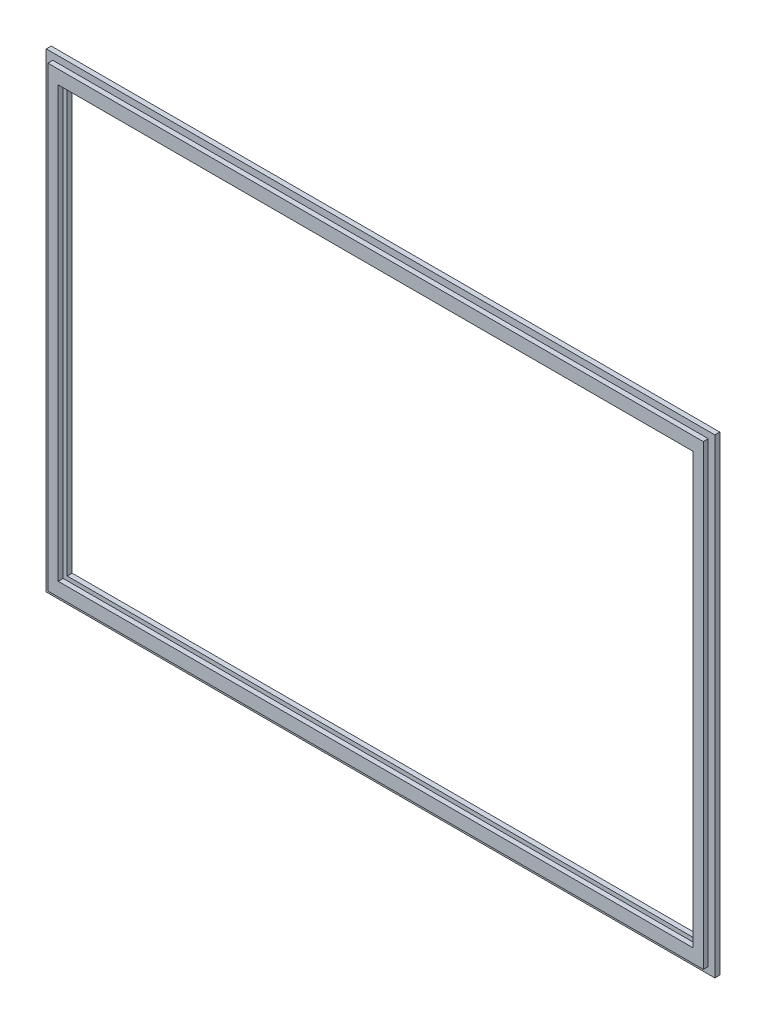
ISO-10303-21;
HEADER;
FILE_DESCRIPTION(('STEP AP214'),'2;1');
FILE_NAME('part.step','',(''),(''),'','','');
FILE_SCHEMA(('AUTOMOTIVE_DESIGN { 1 0 10303 214 1 1 1 1 }'));
ENDSEC;
DATA;
#1=APPLICATION_CONTEXT('core data for automotive mechanical design processes');
#2=APPLICATION_PROTOCOL_DEFINITION('international standard','automotive_design',2000,#1);
#3=PRODUCT_CONTEXT('',#1,'mechanical');
#4=PRODUCT('Part','Part','',(#3));
#5=PRODUCT_RELATED_PRODUCT_CATEGORY('part','',(#4));
#6=PRODUCT_DEFINITION_FORMATION('','',#4);
#7=PRODUCT_DEFINITION_CONTEXT('part definition',#1,'design');
#8=PRODUCT_DEFINITION('design','',#6,#7);
#9=PRODUCT_DEFINITION_SHAPE('','',#8);
#10=(LENGTH_UNIT() NAMED_UNIT(*) SI_UNIT(.MILLI.,.METRE.));
#11=(NAMED_UNIT(*) PLANE_ANGLE_UNIT() SI_UNIT($,.RADIAN.));
#12=(NAMED_UNIT(*) SI_UNIT($,.STERADIAN.) SOLID_ANGLE_UNIT());
#13=UNCERTAINTY_MEASURE_WITH_UNIT(LENGTH_MEASURE(1.E-05),#10,'distance_accuracy_value','');
#14=(GEOMETRIC_REPRESENTATION_CONTEXT(3) GLOBAL_UNCERTAINTY_ASSIGNED_CONTEXT((#13)) GLOBAL_UNIT_ASSIGNED_CONTEXT((#10,
#11,#12)) REPRESENTATION_CONTEXT('',''));
#15=CARTESIAN_POINT('',(0.,0.,0.));
#16=DIRECTION('',(0.,0.,1.));
#17=DIRECTION('',(1.,0.,0.));
#18=AXIS2_PLACEMENT_3D('',#15,#16,#17);
#19=CARTESIAN_POINT('',(0.,0.,0.6));
#20=DIRECTION('',(0.,0.,1.));
#21=DIRECTION('',(1.,0.,0.));
#22=AXIS2_PLACEMENT_3D('',#19,#20,#21);
#23=PLANE('',#22);
#24=DIRECTION('',(0.,-1.,0.));
#25=VECTOR('',#24,1.);
#26=CARTESIAN_POINT('',(-39.75,-27.725,0.6));
#27=LINE('',#26,#25);
#28=CARTESIAN_POINT('',(-39.75,27.725,0.6));
#29=VERTEX_POINT('',#28);
#30=CARTESIAN_POINT('',(-39.75,-27.725,0.6));
#31=VERTEX_POINT('',#30);
#32=EDGE_CURVE('E112',#29,#31,#27,.T.);
#33=ORIENTED_EDGE('',*,*,#32,.T.);
#34=DIRECTION('',(1.,0.,0.));
#35=VECTOR('',#34,1.);
#36=CARTESIAN_POINT('',(39.75,-27.725,0.6));
#37=LINE('',#36,#35);
#38=CARTESIAN_POINT('',(39.75,-27.725,0.6));
#39=VERTEX_POINT('',#38);
#40=EDGE_CURVE('E105',#31,#39,#37,.T.);
#41=ORIENTED_EDGE('',*,*,#40,.T.);
#42=DIRECTION('',(0.,1.,0.));
#43=VECTOR('',#42,1.);
#44=CARTESIAN_POINT('',(39.75,-27.725,0.6));
#45=LINE('',#44,#43);
#46=CARTESIAN_POINT('',(39.75,27.725,0.6));
#47=VERTEX_POINT('',#46);
#48=EDGE_CURVE('E109',#39,#47,#45,.T.);
#49=ORIENTED_EDGE('',*,*,#48,.T.);
#50=DIRECTION('',(-1.,0.,0.));
#51=VECTOR('',#50,1.);
#52=CARTESIAN_POINT('',(39.75,27.725,0.6));
#53=LINE('',#52,#51);
#54=EDGE_CURVE('E68',#47,#29,#53,.T.);
#55=ORIENTED_EDGE('',*,*,#54,.T.);
#56=EDGE_LOOP('',(#33,#41,#49,#55));
#57=FACE_BOUND('',#56,.T.);
#58=DIRECTION('',(1.,0.,0.));
#59=VECTOR('',#58,1.);
#60=CARTESIAN_POINT('',(38.5,-26.075,0.6));
#61=LINE('',#60,#59);
#62=CARTESIAN_POINT('',(-38.5,-26.075,0.6));
#63=VERTEX_POINT('',#62);
#64=CARTESIAN_POINT('',(38.5,-26.075,0.6));
#65=VERTEX_POINT('',#64);
#66=EDGE_CURVE('E171',#63,#65,#61,.T.);
#67=ORIENTED_EDGE('',*,*,#66,.F.);
#68=DIRECTION('',(0.,-1.,0.));
#69=VECTOR('',#68,1.);
#70=CARTESIAN_POINT('',(-38.5,-26.075,0.6));
#71=LINE('',#70,#69);
#72=CARTESIAN_POINT('',(-38.5,26.075,0.6));
#73=VERTEX_POINT('',#72);
#74=EDGE_CURVE('E163',#73,#63,#71,.T.);
#75=ORIENTED_EDGE('',*,*,#74,.F.);
#76=DIRECTION('',(-1.,0.,0.));
#77=VECTOR('',#76,1.);
#78=CARTESIAN_POINT('',(38.5,26.075,0.6));
#79=LINE('',#78,#77);
#80=CARTESIAN_POINT('',(38.5,26.075,0.6));
#81=VERTEX_POINT('',#80);
#82=EDGE_CURVE('E89',#81,#73,#79,.T.);
#83=ORIENTED_EDGE('',*,*,#82,.F.);
#84=DIRECTION('',(0.,1.,0.));
#85=VECTOR('',#84,1.);
#86=CARTESIAN_POINT('',(38.5,-26.075,0.6));
#87=LINE('',#86,#85);
#88=EDGE_CURVE('E183',#65,#81,#87,.T.);
#89=ORIENTED_EDGE('',*,*,#88,.F.);
#90=EDGE_LOOP('',(#67,#75,#83,#89));
#91=FACE_BOUND('',#90,.T.);
#92=ADVANCED_FACE('F43',(#57,#91),#23,.T.);
#93=CARTESIAN_POINT('',(-39.75,-27.725,0.6));
#94=DIRECTION('',(1.,0.,0.));
#95=DIRECTION('',(0.,1.,0.));
#96=AXIS2_PLACEMENT_3D('',#93,#94,#95);
#97=PLANE('',#96);
#98=DIRECTION('',(0.,-1.,0.));
#99=VECTOR('',#98,1.);
#100=CARTESIAN_POINT('',(-39.75,-27.725,0.));
#101=LINE('',#100,#99);
#102=CARTESIAN_POINT('',(-39.75,27.725,0.));
#103=VERTEX_POINT('',#102);
#104=CARTESIAN_POINT('',(-39.75,-27.725,0.));
#105=VERTEX_POINT('',#104);
#106=EDGE_CURVE('E132',#103,#105,#101,.T.);
#107=ORIENTED_EDGE('',*,*,#106,.T.);
#108=DIRECTION('',(0.,0.,-1.));
#109=VECTOR('',#108,1.);
#110=CARTESIAN_POINT('',(-39.75,-27.725,0.6));
#111=LINE('',#110,#109);
#112=EDGE_CURVE('E11',#31,#105,#111,.T.);
#113=ORIENTED_EDGE('',*,*,#112,.F.);
#114=ORIENTED_EDGE('',*,*,#32,.F.);
#115=DIRECTION('',(0.,0.,-1.));
#116=VECTOR('',#115,1.);
#117=CARTESIAN_POINT('',(-39.75,27.725,0.6));
#118=LINE('',#117,#116);
#119=EDGE_CURVE('E128',#29,#103,#118,.T.);
#120=ORIENTED_EDGE('',*,*,#119,.T.);
#121=EDGE_LOOP('',(#107,#113,#114,#120));
#122=FACE_BOUND('',#121,.T.);
#123=ADVANCED_FACE('F45',(#122),#97,.F.);
#124=CARTESIAN_POINT('',(39.75,-27.725,0.6));
#125=DIRECTION('',(0.,1.,0.));
#126=DIRECTION('',(-1.,0.,0.));
#127=AXIS2_PLACEMENT_3D('',#124,#125,#126);
#128=PLANE('',#127);
#129=DIRECTION('',(1.,0.,0.));
#130=VECTOR('',#129,1.);
#131=CARTESIAN_POINT('',(39.75,-27.725,0.));
#132=LINE('',#131,#130);
#133=CARTESIAN_POINT('',(39.75,-27.725,0.));
#134=VERTEX_POINT('',#133);
#135=EDGE_CURVE('E119',#105,#134,#132,.T.);
#136=ORIENTED_EDGE('',*,*,#135,.T.);
#137=DIRECTION('',(0.,0.,-1.));
#138=VECTOR('',#137,1.);
#139=CARTESIAN_POINT('',(39.75,-27.725,0.6));
#140=LINE('',#139,#138);
#141=EDGE_CURVE('E52',#39,#134,#140,.T.);
#142=ORIENTED_EDGE('',*,*,#141,.F.);
#143=ORIENTED_EDGE('',*,*,#40,.F.);
#144=ORIENTED_EDGE('',*,*,#112,.T.);
#145=EDGE_LOOP('',(#136,#142,#143,#144));
#146=FACE_BOUND('',#145,.T.);
#147=ADVANCED_FACE('F118',(#146),#128,.F.);
#148=CARTESIAN_POINT('',(39.75,-27.725,0.6));
#149=DIRECTION('',(-1.,0.,0.));
#150=DIRECTION('',(0.,0.,1.));
#151=AXIS2_PLACEMENT_3D('',#148,#149,#150);
#152=PLANE('',#151);
#153=DIRECTION('',(0.,1.,0.));
#154=VECTOR('',#153,1.);
#155=CARTESIAN_POINT('',(39.75,-27.725,0.));
#156=LINE('',#155,#154);
#157=CARTESIAN_POINT('',(39.75,27.725,0.));
#158=VERTEX_POINT('',#157);
#159=EDGE_CURVE('E81',#134,#158,#156,.T.);
#160=ORIENTED_EDGE('',*,*,#159,.T.);
#161=DIRECTION('',(0.,0.,-1.));
#162=VECTOR('',#161,1.);
#163=CARTESIAN_POINT('',(39.75,27.725,0.6));
#164=LINE('',#163,#162);
#165=EDGE_CURVE('E122',#47,#158,#164,.T.);
#166=ORIENTED_EDGE('',*,*,#165,.F.);
#167=ORIENTED_EDGE('',*,*,#48,.F.);
#168=ORIENTED_EDGE('',*,*,#141,.T.);
#169=EDGE_LOOP('',(#160,#166,#167,#168));
#170=FACE_BOUND('',#169,.T.);
#171=ADVANCED_FACE('F123',(#170),#152,.F.);
#172=CARTESIAN_POINT('',(39.75,27.725,0.6));
#173=DIRECTION('',(0.,-1.,0.));
#174=DIRECTION('',(1.,0.,0.));
#175=AXIS2_PLACEMENT_3D('',#172,#173,#174);
#176=PLANE('',#175);
#177=DIRECTION('',(-1.,0.,0.));
#178=VECTOR('',#177,1.);
#179=CARTESIAN_POINT('',(39.75,27.725,0.));
#180=LINE('',#179,#178);
#181=EDGE_CURVE('E141',#158,#103,#180,.T.);
#182=ORIENTED_EDGE('',*,*,#181,.T.);
#183=ORIENTED_EDGE('',*,*,#119,.F.);
#184=ORIENTED_EDGE('',*,*,#54,.F.);
#185=ORIENTED_EDGE('',*,*,#165,.T.);
#186=EDGE_LOOP('',(#182,#183,#184,#185));
#187=FACE_BOUND('',#186,.T.);
#188=ADVANCED_FACE('F151',(#187),#176,.F.);
#189=CARTESIAN_POINT('',(-38.5,-26.075,0.6));
#190=DIRECTION('',(1.,0.,0.));
#191=DIRECTION('',(0.,0.,-1.));
#192=AXIS2_PLACEMENT_3D('',#189,#190,#191);
#193=PLANE('',#192);
#194=DIRECTION('',(0.,-1.,0.));
#195=VECTOR('',#194,1.);
#196=CARTESIAN_POINT('',(-38.5,-26.075,0.));
#197=LINE('',#196,#195);
#198=CARTESIAN_POINT('',(-38.5,26.075,0.));
#199=VERTEX_POINT('',#198);
#200=CARTESIAN_POINT('',(-38.5,-26.075,0.));
#201=VERTEX_POINT('',#200);
#202=EDGE_CURVE('E192',#199,#201,#197,.T.);
#203=ORIENTED_EDGE('',*,*,#202,.F.);
#204=DIRECTION('',(0.,0.,-1.));
#205=VECTOR('',#204,1.);
#206=CARTESIAN_POINT('',(-38.5,26.075,0.6));
#207=LINE('',#206,#205);
#208=EDGE_CURVE('E168',#73,#199,#207,.T.);
#209=ORIENTED_EDGE('',*,*,#208,.F.);
#210=ORIENTED_EDGE('',*,*,#74,.T.);
#211=DIRECTION('',(0.,0.,-1.));
#212=VECTOR('',#211,1.);
#213=CARTESIAN_POINT('',(-38.5,-26.075,0.6));
#214=LINE('',#213,#212);
#215=EDGE_CURVE('E136',#63,#201,#214,.T.);
#216=ORIENTED_EDGE('',*,*,#215,.T.);
#217=EDGE_LOOP('',(#203,#209,#210,#216));
#218=FACE_BOUND('',#217,.T.);
#219=ADVANCED_FACE('F166',(#218),#193,.T.);
#220=CARTESIAN_POINT('',(38.5,-26.075,0.6));
#221=DIRECTION('',(0.,1.,0.));
#222=DIRECTION('',(-1.,0.,0.));
#223=AXIS2_PLACEMENT_3D('',#220,#221,#222);
#224=PLANE('',#223);
#225=DIRECTION('',(1.,0.,0.));
#226=VECTOR('',#225,1.);
#227=CARTESIAN_POINT('',(38.5,-26.075,0.));
#228=LINE('',#227,#226);
#229=CARTESIAN_POINT('',(38.5,-26.075,0.));
#230=VERTEX_POINT('',#229);
#231=EDGE_CURVE('E178',#201,#230,#228,.T.);
#232=ORIENTED_EDGE('',*,*,#231,.F.);
#233=ORIENTED_EDGE('',*,*,#215,.F.);
#234=ORIENTED_EDGE('',*,*,#66,.T.);
#235=DIRECTION('',(0.,0.,-1.));
#236=VECTOR('',#235,1.);
#237=CARTESIAN_POINT('',(38.5,-26.075,0.6));
#238=LINE('',#237,#236);
#239=EDGE_CURVE('E180',#65,#230,#238,.T.);
#240=ORIENTED_EDGE('',*,*,#239,.T.);
#241=EDGE_LOOP('',(#232,#233,#234,#240));
#242=FACE_BOUND('',#241,.T.);
#243=ADVANCED_FACE('F175',(#242),#224,.T.);
#244=CARTESIAN_POINT('',(38.5,-26.075,0.6));
#245=DIRECTION('',(-1.,0.,0.));
#246=DIRECTION('',(0.,0.,1.));
#247=AXIS2_PLACEMENT_3D('',#244,#245,#246);
#248=PLANE('',#247);
#249=DIRECTION('',(0.,1.,0.));
#250=VECTOR('',#249,1.);
#251=CARTESIAN_POINT('',(38.5,-26.075,0.));
#252=LINE('',#251,#250);
#253=CARTESIAN_POINT('',(38.5,26.075,0.));
#254=VERTEX_POINT('',#253);
#255=EDGE_CURVE('E198',#230,#254,#252,.T.);
#256=ORIENTED_EDGE('',*,*,#255,.F.);
#257=ORIENTED_EDGE('',*,*,#239,.F.);
#258=ORIENTED_EDGE('',*,*,#88,.T.);
#259=DIRECTION('',(0.,0.,-1.));
#260=VECTOR('',#259,1.);
#261=CARTESIAN_POINT('',(38.5,26.075,0.6));
#262=LINE('',#261,#260);
#263=EDGE_CURVE('E59',#81,#254,#262,.T.);
#264=ORIENTED_EDGE('',*,*,#263,.T.);
#265=EDGE_LOOP('',(#256,#257,#258,#264));
#266=FACE_BOUND('',#265,.T.);
#267=ADVANCED_FACE('F213',(#266),#248,.T.);
#268=CARTESIAN_POINT('',(38.5,26.075,0.6));
#269=DIRECTION('',(0.,-1.,0.));
#270=DIRECTION('',(1.,0.,0.));
#271=AXIS2_PLACEMENT_3D('',#268,#269,#270);
#272=PLANE('',#271);
#273=DIRECTION('',(-1.,0.,0.));
#274=VECTOR('',#273,1.);
#275=CARTESIAN_POINT('',(38.5,26.075,0.));
#276=LINE('',#275,#274);
#277=EDGE_CURVE('E172',#254,#199,#276,.T.);
#278=ORIENTED_EDGE('',*,*,#277,.F.);
#279=ORIENTED_EDGE('',*,*,#263,.F.);
#280=ORIENTED_EDGE('',*,*,#82,.T.);
#281=ORIENTED_EDGE('',*,*,#208,.T.);
#282=EDGE_LOOP('',(#278,#279,#280,#281));
#283=FACE_BOUND('',#282,.T.);
#284=ADVANCED_FACE('F388',(#283),#272,.T.);
#285=CARTESIAN_POINT('',(0.,0.,0.));
#286=DIRECTION('',(0.,0.,-1.));
#287=DIRECTION('',(-1.,0.,0.));
#288=AXIS2_PLACEMENT_3D('',#285,#286,#287);
#289=PLANE('',#288);
#290=DIRECTION('',(-1.,0.,0.));
#291=VECTOR('',#290,1.);
#292=CARTESIAN_POINT('',(38.,-25.575,0.));
#293=LINE('',#292,#291);
#294=CARTESIAN_POINT('',(38.,-25.575,0.));
#295=VERTEX_POINT('',#294);
#296=CARTESIAN_POINT('',(-38.,-25.575,0.));
#297=VERTEX_POINT('',#296);
#298=EDGE_CURVE('E303',#295,#297,#293,.T.);
#299=ORIENTED_EDGE('',*,*,#298,.T.);
#300=DIRECTION('',(0.,1.,0.));
#301=VECTOR('',#300,1.);
#302=CARTESIAN_POINT('',(-38.,-25.575,0.));
#303=LINE('',#302,#301);
#304=CARTESIAN_POINT('',(-38.,25.575,0.));
#305=VERTEX_POINT('',#304);
#306=EDGE_CURVE('E286',#297,#305,#303,.T.);
#307=ORIENTED_EDGE('',*,*,#306,.T.);
#308=DIRECTION('',(1.,0.,0.));
#309=VECTOR('',#308,1.);
#310=CARTESIAN_POINT('',(-38.,25.575,0.));
#311=LINE('',#310,#309);
#312=CARTESIAN_POINT('',(38.,25.575,0.));
#313=VERTEX_POINT('',#312);
#314=EDGE_CURVE('E308',#305,#313,#311,.T.);
#315=ORIENTED_EDGE('',*,*,#314,.T.);
#316=DIRECTION('',(0.,-1.,0.));
#317=VECTOR('',#316,1.);
#318=CARTESIAN_POINT('',(38.,25.575,0.));
#319=LINE('',#318,#317);
#320=EDGE_CURVE('E280',#313,#295,#319,.T.);
#321=ORIENTED_EDGE('',*,*,#320,.T.);
#322=EDGE_LOOP('',(#299,#307,#315,#321));
#323=FACE_BOUND('',#322,.T.);
#324=ORIENTED_EDGE('',*,*,#277,.T.);
#325=ORIENTED_EDGE('',*,*,#202,.T.);
#326=ORIENTED_EDGE('',*,*,#231,.T.);
#327=ORIENTED_EDGE('',*,*,#255,.T.);
#328=EDGE_LOOP('',(#324,#325,#326,#327));
#329=FACE_BOUND('',#328,.T.);
#330=ADVANCED_FACE('F215',(#323,#329),#289,.F.);
#331=CARTESIAN_POINT('',(0.,0.,-0.6));
#332=DIRECTION('',(0.,0.,-1.));
#333=DIRECTION('',(-1.,0.,0.));
#334=AXIS2_PLACEMENT_3D('',#331,#332,#333);
#335=PLANE('',#334);
#336=DIRECTION('',(0.,-1.,0.));
#337=VECTOR('',#336,1.);
#338=CARTESIAN_POINT('',(40.55,28.525,-0.6));
#339=LINE('',#338,#337);
#340=CARTESIAN_POINT('',(40.55,28.525,-0.6));
#341=VERTEX_POINT('',#340);
#342=CARTESIAN_POINT('',(40.55,-28.525,-0.6));
#343=VERTEX_POINT('',#342);
#344=EDGE_CURVE('E322',#341,#343,#339,.T.);
#345=ORIENTED_EDGE('',*,*,#344,.T.);
#346=DIRECTION('',(-1.,0.,0.));
#347=VECTOR('',#346,1.);
#348=CARTESIAN_POINT('',(40.55,-28.525,-0.6));
#349=LINE('',#348,#347);
#350=CARTESIAN_POINT('',(-40.55,-28.525,-0.6));
#351=VERTEX_POINT('',#350);
#352=EDGE_CURVE('E326',#343,#351,#349,.T.);
#353=ORIENTED_EDGE('',*,*,#352,.T.);
#354=DIRECTION('',(0.,1.,0.));
#355=VECTOR('',#354,1.);
#356=CARTESIAN_POINT('',(-40.55,-28.525,-0.6));
#357=LINE('',#356,#355);
#358=CARTESIAN_POINT('',(-40.55,28.525,-0.6));
#359=VERTEX_POINT('',#358);
#360=EDGE_CURVE('E330',#351,#359,#357,.T.);
#361=ORIENTED_EDGE('',*,*,#360,.T.);
#362=DIRECTION('',(1.,0.,0.));
#363=VECTOR('',#362,1.);
#364=CARTESIAN_POINT('',(-40.55,28.525,-0.6));
#365=LINE('',#364,#363);
#366=EDGE_CURVE('E333',#359,#341,#365,.T.);
#367=ORIENTED_EDGE('',*,*,#366,.T.);
#368=EDGE_LOOP('',(#345,#353,#361,#367));
#369=FACE_BOUND('',#368,.T.);
#370=DIRECTION('',(0.,1.,0.));
#371=VECTOR('',#370,1.);
#372=CARTESIAN_POINT('',(-38.,-25.575,-0.6));
#373=LINE('',#372,#371);
#374=CARTESIAN_POINT('',(-38.,-25.575,-0.6));
#375=VERTEX_POINT('',#374);
#376=CARTESIAN_POINT('',(-38.,25.575,-0.6));
#377=VERTEX_POINT('',#376);
#378=EDGE_CURVE('E279',#375,#377,#373,.T.);
#379=ORIENTED_EDGE('',*,*,#378,.F.);
#380=DIRECTION('',(-1.,0.,0.));
#381=VECTOR('',#380,1.);
#382=CARTESIAN_POINT('',(38.,-25.575,-0.6));
#383=LINE('',#382,#381);
#384=CARTESIAN_POINT('',(38.,-25.575,-0.6));
#385=VERTEX_POINT('',#384);
#386=EDGE_CURVE('E268',#385,#375,#383,.T.);
#387=ORIENTED_EDGE('',*,*,#386,.F.);
#388=DIRECTION('',(0.,-1.,0.));
#389=VECTOR('',#388,1.);
#390=CARTESIAN_POINT('',(38.,25.575,-0.6));
#391=LINE('',#390,#389);
#392=CARTESIAN_POINT('',(38.,25.575,-0.6));
#393=VERTEX_POINT('',#392);
#394=EDGE_CURVE('E298',#393,#385,#391,.T.);
#395=ORIENTED_EDGE('',*,*,#394,.F.);
#396=DIRECTION('',(1.,0.,0.));
#397=VECTOR('',#396,1.);
#398=CARTESIAN_POINT('',(-38.,25.575,-0.6));
#399=LINE('',#398,#397);
#400=EDGE_CURVE('E294',#377,#393,#399,.T.);
#401=ORIENTED_EDGE('',*,*,#400,.F.);
#402=EDGE_LOOP('',(#379,#387,#395,#401));
#403=FACE_BOUND('',#402,.T.);
#404=ADVANCED_FACE('F292',(#369,#403),#335,.T.);
#405=ORIENTED_EDGE('',*,*,#106,.F.);
#406=ORIENTED_EDGE('',*,*,#181,.F.);
#407=ORIENTED_EDGE('',*,*,#159,.F.);
#408=ORIENTED_EDGE('',*,*,#135,.F.);
#409=EDGE_LOOP('',(#405,#406,#407,#408));
#410=FACE_BOUND('',#409,.T.);
#411=DIRECTION('',(0.,-1.,0.));
#412=VECTOR('',#411,1.);
#413=CARTESIAN_POINT('',(40.55,28.525,0.));
#414=LINE('',#413,#412);
#415=CARTESIAN_POINT('',(40.55,28.525,0.));
#416=VERTEX_POINT('',#415);
#417=CARTESIAN_POINT('',(40.55,-28.525,0.));
#418=VERTEX_POINT('',#417);
#419=EDGE_CURVE('E288',#416,#418,#414,.T.);
#420=ORIENTED_EDGE('',*,*,#419,.F.);
#421=DIRECTION('',(1.,0.,0.));
#422=VECTOR('',#421,1.);
#423=CARTESIAN_POINT('',(-40.55,28.525,0.));
#424=LINE('',#423,#422);
#425=CARTESIAN_POINT('',(-40.55,28.525,0.));
#426=VERTEX_POINT('',#425);
#427=EDGE_CURVE('E327',#426,#416,#424,.T.);
#428=ORIENTED_EDGE('',*,*,#427,.F.);
#429=DIRECTION('',(0.,1.,0.));
#430=VECTOR('',#429,1.);
#431=CARTESIAN_POINT('',(-40.55,-28.525,0.));
#432=LINE('',#431,#430);
#433=CARTESIAN_POINT('',(-40.55,-28.525,0.));
#434=VERTEX_POINT('',#433);
#435=EDGE_CURVE('E343',#434,#426,#432,.T.);
#436=ORIENTED_EDGE('',*,*,#435,.F.);
#437=DIRECTION('',(-1.,0.,0.));
#438=VECTOR('',#437,1.);
#439=CARTESIAN_POINT('',(40.55,-28.525,0.));
#440=LINE('',#439,#438);
#441=EDGE_CURVE('E340',#418,#434,#440,.T.);
#442=ORIENTED_EDGE('',*,*,#441,.F.);
#443=EDGE_LOOP('',(#420,#428,#436,#442));
#444=FACE_BOUND('',#443,.T.);
#445=ADVANCED_FACE('F371',(#410,#444),#289,.F.);
#446=CARTESIAN_POINT('',(40.55,28.525,-0.6));
#447=DIRECTION('',(-1.,0.,0.));
#448=DIRECTION('',(0.,0.,1.));
#449=AXIS2_PLACEMENT_3D('',#446,#447,#448);
#450=PLANE('',#449);
#451=ORIENTED_EDGE('',*,*,#419,.T.);
#452=DIRECTION('',(0.,0.,1.));
#453=VECTOR('',#452,1.);
#454=CARTESIAN_POINT('',(40.55,-28.525,-0.6));
#455=LINE('',#454,#453);
#456=EDGE_CURVE('E195',#343,#418,#455,.T.);
#457=ORIENTED_EDGE('',*,*,#456,.F.);
#458=ORIENTED_EDGE('',*,*,#344,.F.);
#459=DIRECTION('',(0.,0.,1.));
#460=VECTOR('',#459,1.);
#461=CARTESIAN_POINT('',(40.55,28.525,-0.6));
#462=LINE('',#461,#460);
#463=EDGE_CURVE('E336',#341,#416,#462,.T.);
#464=ORIENTED_EDGE('',*,*,#463,.T.);
#465=EDGE_LOOP('',(#451,#457,#458,#464));
#466=FACE_BOUND('',#465,.T.);
#467=ADVANCED_FACE('F367',(#466),#450,.F.);
#468=CARTESIAN_POINT('',(40.55,-28.525,-0.6));
#469=DIRECTION('',(0.,1.,0.));
#470=DIRECTION('',(-1.,0.,0.));
#471=AXIS2_PLACEMENT_3D('',#468,#469,#470);
#472=PLANE('',#471);
#473=ORIENTED_EDGE('',*,*,#441,.T.);
#474=DIRECTION('',(0.,0.,1.));
#475=VECTOR('',#474,1.);
#476=CARTESIAN_POINT('',(-40.55,-28.525,-0.6));
#477=LINE('',#476,#475);
#478=EDGE_CURVE('E355',#351,#434,#477,.T.);
#479=ORIENTED_EDGE('',*,*,#478,.F.);
#480=ORIENTED_EDGE('',*,*,#352,.F.);
#481=ORIENTED_EDGE('',*,*,#456,.T.);
#482=EDGE_LOOP('',(#473,#479,#480,#481));
#483=FACE_BOUND('',#482,.T.);
#484=ADVANCED_FACE('F362',(#483),#472,.F.);
#485=CARTESIAN_POINT('',(-40.55,-28.525,-0.6));
#486=DIRECTION('',(1.,0.,0.));
#487=DIRECTION('',(0.,1.,0.));
#488=AXIS2_PLACEMENT_3D('',#485,#486,#487);
#489=PLANE('',#488);
#490=ORIENTED_EDGE('',*,*,#435,.T.);
#491=DIRECTION('',(0.,0.,1.));
#492=VECTOR('',#491,1.);
#493=CARTESIAN_POINT('',(-40.55,28.525,-0.6));
#494=LINE('',#493,#492);
#495=EDGE_CURVE('E351',#359,#426,#494,.T.);
#496=ORIENTED_EDGE('',*,*,#495,.F.);
#497=ORIENTED_EDGE('',*,*,#360,.F.);
#498=ORIENTED_EDGE('',*,*,#478,.T.);
#499=EDGE_LOOP('',(#490,#496,#497,#498));
#500=FACE_BOUND('',#499,.T.);
#501=ADVANCED_FACE('F375',(#500),#489,.F.);
#502=CARTESIAN_POINT('',(-40.55,28.525,-0.6));
#503=DIRECTION('',(0.,-1.,0.));
#504=DIRECTION('',(1.,0.,0.));
#505=AXIS2_PLACEMENT_3D('',#502,#503,#504);
#506=PLANE('',#505);
#507=ORIENTED_EDGE('',*,*,#427,.T.);
#508=ORIENTED_EDGE('',*,*,#463,.F.);
#509=ORIENTED_EDGE('',*,*,#366,.F.);
#510=ORIENTED_EDGE('',*,*,#495,.T.);
#511=EDGE_LOOP('',(#507,#508,#509,#510));
#512=FACE_BOUND('',#511,.T.);
#513=ADVANCED_FACE('F379',(#512),#506,.F.);
#514=CARTESIAN_POINT('',(38.,-25.575,-0.6));
#515=DIRECTION('',(0.,1.,0.));
#516=DIRECTION('',(-1.,0.,0.));
#517=AXIS2_PLACEMENT_3D('',#514,#515,#516);
#518=PLANE('',#517);
#519=ORIENTED_EDGE('',*,*,#298,.F.);
#520=DIRECTION('',(0.,0.,1.));
#521=VECTOR('',#520,1.);
#522=CARTESIAN_POINT('',(38.,-25.575,-0.6));
#523=LINE('',#522,#521);
#524=EDGE_CURVE('E274',#385,#295,#523,.T.);
#525=ORIENTED_EDGE('',*,*,#524,.F.);
#526=ORIENTED_EDGE('',*,*,#386,.T.);
#527=DIRECTION('',(0.,0.,1.));
#528=VECTOR('',#527,1.);
#529=CARTESIAN_POINT('',(-38.,-25.575,-0.6));
#530=LINE('',#529,#528);
#531=EDGE_CURVE('E271',#375,#297,#530,.T.);
#532=ORIENTED_EDGE('',*,*,#531,.T.);
#533=EDGE_LOOP('',(#519,#525,#526,#532));
#534=FACE_BOUND('',#533,.T.);
#535=ADVANCED_FACE('F270',(#534),#518,.T.);
#536=CARTESIAN_POINT('',(-38.,-25.575,-0.6));
#537=DIRECTION('',(1.,0.,0.));
#538=DIRECTION('',(0.,0.,-1.));
#539=AXIS2_PLACEMENT_3D('',#536,#537,#538);
#540=PLANE('',#539);
#541=ORIENTED_EDGE('',*,*,#306,.F.);
#542=ORIENTED_EDGE('',*,*,#531,.F.);
#543=ORIENTED_EDGE('',*,*,#378,.T.);
#544=DIRECTION('',(0.,0.,1.));
#545=VECTOR('',#544,1.);
#546=CARTESIAN_POINT('',(-38.,25.575,-0.6));
#547=LINE('',#546,#545);
#548=EDGE_CURVE('E289',#377,#305,#547,.T.);
#549=ORIENTED_EDGE('',*,*,#548,.T.);
#550=EDGE_LOOP('',(#541,#542,#543,#549));
#551=FACE_BOUND('',#550,.T.);
#552=ADVANCED_FACE('F283',(#551),#540,.T.);
#553=CARTESIAN_POINT('',(-38.,25.575,-0.6));
#554=DIRECTION('',(0.,-1.,0.));
#555=DIRECTION('',(1.,0.,0.));
#556=AXIS2_PLACEMENT_3D('',#553,#554,#555);
#557=PLANE('',#556);
#558=ORIENTED_EDGE('',*,*,#314,.F.);
#559=ORIENTED_EDGE('',*,*,#548,.F.);
#560=ORIENTED_EDGE('',*,*,#400,.T.);
#561=DIRECTION('',(0.,0.,1.));
#562=VECTOR('',#561,1.);
#563=CARTESIAN_POINT('',(38.,25.575,-0.6));
#564=LINE('',#563,#562);
#565=EDGE_CURVE('E317',#393,#313,#564,.T.);
#566=ORIENTED_EDGE('',*,*,#565,.T.);
#567=EDGE_LOOP('',(#558,#559,#560,#566));
#568=FACE_BOUND('',#567,.T.);
#569=ADVANCED_FACE('F508',(#568),#557,.T.);
#570=CARTESIAN_POINT('',(38.,25.575,-0.6));
#571=DIRECTION('',(-1.,0.,0.));
#572=DIRECTION('',(0.,0.,1.));
#573=AXIS2_PLACEMENT_3D('',#570,#571,#572);
#574=PLANE('',#573);
#575=ORIENTED_EDGE('',*,*,#320,.F.);
#576=ORIENTED_EDGE('',*,*,#565,.F.);
#577=ORIENTED_EDGE('',*,*,#394,.T.);
#578=ORIENTED_EDGE('',*,*,#524,.T.);
#579=EDGE_LOOP('',(#575,#576,#577,#578));
#580=FACE_BOUND('',#579,.T.);
#581=ADVANCED_FACE('F518',(#580),#574,.T.);
#582=CLOSED_SHELL('',(#92,#123,#147,#171,#188,#219,#243,#267,#284,#330,#404,#445,#467,#484,#501,
#513,#535,#552,#569,#581));
#583=MANIFOLD_SOLID_BREP('B2',#582);
#584=ADVANCED_BREP_SHAPE_REPRESENTATION('',(#18,#583),#14);
#585=SHAPE_DEFINITION_REPRESENTATION(#9,#584);
ENDSEC;
END-ISO-10303-21;
